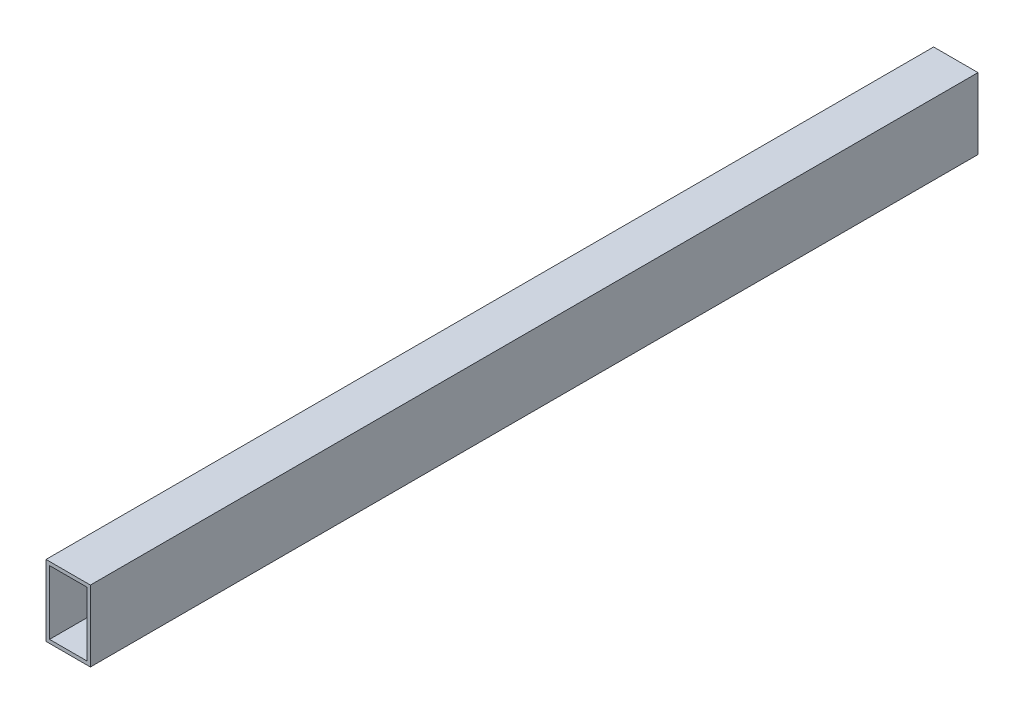
ISO-10303-21;
HEADER;
FILE_DESCRIPTION(('STEP AP214'),'2;1');
FILE_NAME('part.step','',(''),(''),'','','');
FILE_SCHEMA(('AUTOMOTIVE_DESIGN { 1 0 10303 214 1 1 1 1 }'));
ENDSEC;
DATA;
#1=APPLICATION_CONTEXT('core data for automotive mechanical design processes');
#2=APPLICATION_PROTOCOL_DEFINITION('international standard','automotive_design',2000,#1);
#3=PRODUCT_CONTEXT('',#1,'mechanical');
#4=PRODUCT('Part','Part','',(#3));
#5=PRODUCT_RELATED_PRODUCT_CATEGORY('part','',(#4));
#6=PRODUCT_DEFINITION_FORMATION('','',#4);
#7=PRODUCT_DEFINITION_CONTEXT('part definition',#1,'design');
#8=PRODUCT_DEFINITION('design','',#6,#7);
#9=PRODUCT_DEFINITION_SHAPE('','',#8);
#10=(LENGTH_UNIT() NAMED_UNIT(*) SI_UNIT(.MILLI.,.METRE.));
#11=(NAMED_UNIT(*) PLANE_ANGLE_UNIT() SI_UNIT($,.RADIAN.));
#12=(NAMED_UNIT(*) SI_UNIT($,.STERADIAN.) SOLID_ANGLE_UNIT());
#13=UNCERTAINTY_MEASURE_WITH_UNIT(LENGTH_MEASURE(1.E-05),#10,'distance_accuracy_value','');
#14=(GEOMETRIC_REPRESENTATION_CONTEXT(3) GLOBAL_UNCERTAINTY_ASSIGNED_CONTEXT((#13)) GLOBAL_UNIT_ASSIGNED_CONTEXT((#10,
#11,#12)) REPRESENTATION_CONTEXT('',''));
#15=CARTESIAN_POINT('',(0.,0.,0.));
#16=DIRECTION('',(0.,0.,1.));
#17=DIRECTION('',(1.,0.,0.));
#18=AXIS2_PLACEMENT_3D('',#15,#16,#17);
#19=CARTESIAN_POINT('',(-25.,40.,1000.));
#20=DIRECTION('',(1.,0.,0.));
#21=DIRECTION('',(0.,1.,0.));
#22=AXIS2_PLACEMENT_3D('',#19,#20,#21);
#23=PLANE('',#22);
#24=DIRECTION('',(0.,-1.,0.));
#25=VECTOR('',#24,1.);
#26=CARTESIAN_POINT('',(-25.,40.,0.));
#27=LINE('',#26,#25);
#28=CARTESIAN_POINT('',(-25.,40.,0.));
#29=VERTEX_POINT('',#28);
#30=CARTESIAN_POINT('',(-25.,-40.,0.));
#31=VERTEX_POINT('',#30);
#32=EDGE_CURVE('E147',#29,#31,#27,.T.);
#33=ORIENTED_EDGE('',*,*,#32,.T.);
#34=DIRECTION('',(0.,0.,-1.));
#35=VECTOR('',#34,1.);
#36=CARTESIAN_POINT('',(-25.,-40.,1000.));
#37=LINE('',#36,#35);
#38=CARTESIAN_POINT('',(-25.,-40.,1000.));
#39=VERTEX_POINT('',#38);
#40=EDGE_CURVE('E11',#39,#31,#37,.T.);
#41=ORIENTED_EDGE('',*,*,#40,.F.);
#42=DIRECTION('',(0.,-1.,0.));
#43=VECTOR('',#42,1.);
#44=CARTESIAN_POINT('',(-25.,40.,1000.));
#45=LINE('',#44,#43);
#46=CARTESIAN_POINT('',(-25.,40.,1000.));
#47=VERTEX_POINT('',#46);
#48=EDGE_CURVE('E153',#47,#39,#45,.T.);
#49=ORIENTED_EDGE('',*,*,#48,.F.);
#50=DIRECTION('',(0.,0.,-1.));
#51=VECTOR('',#50,1.);
#52=CARTESIAN_POINT('',(-25.,40.,1000.));
#53=LINE('',#52,#51);
#54=EDGE_CURVE('E169',#47,#29,#53,.T.);
#55=ORIENTED_EDGE('',*,*,#54,.T.);
#56=EDGE_LOOP('',(#33,#41,#49,#55));
#57=FACE_BOUND('',#56,.T.);
#58=ADVANCED_FACE('F39',(#57),#23,.F.);
#59=CARTESIAN_POINT('',(-25.,-40.,1000.));
#60=DIRECTION('',(0.,1.,0.));
#61=DIRECTION('',(0.,0.,1.));
#62=AXIS2_PLACEMENT_3D('',#59,#60,#61);
#63=PLANE('',#62);
#64=DIRECTION('',(1.,0.,0.));
#65=VECTOR('',#64,1.);
#66=CARTESIAN_POINT('',(-25.,-40.,0.));
#67=LINE('',#66,#65);
#68=CARTESIAN_POINT('',(25.,-40.,0.));
#69=VERTEX_POINT('',#68);
#70=EDGE_CURVE('E173',#31,#69,#67,.T.);
#71=ORIENTED_EDGE('',*,*,#70,.T.);
#72=DIRECTION('',(0.,0.,-1.));
#73=VECTOR('',#72,1.);
#74=CARTESIAN_POINT('',(25.,-40.,1000.));
#75=LINE('',#74,#73);
#76=CARTESIAN_POINT('',(25.,-40.,1000.));
#77=VERTEX_POINT('',#76);
#78=EDGE_CURVE('E47',#77,#69,#75,.T.);
#79=ORIENTED_EDGE('',*,*,#78,.F.);
#80=DIRECTION('',(1.,0.,0.));
#81=VECTOR('',#80,1.);
#82=CARTESIAN_POINT('',(-25.,-40.,1000.));
#83=LINE('',#82,#81);
#84=EDGE_CURVE('E157',#39,#77,#83,.T.);
#85=ORIENTED_EDGE('',*,*,#84,.F.);
#86=ORIENTED_EDGE('',*,*,#40,.T.);
#87=EDGE_LOOP('',(#71,#79,#85,#86));
#88=FACE_BOUND('',#87,.T.);
#89=ADVANCED_FACE('F195',(#88),#63,.F.);
#90=CARTESIAN_POINT('',(25.,40.,1000.));
#91=DIRECTION('',(1.,0.,0.));
#92=DIRECTION('',(0.,0.,-1.));
#93=AXIS2_PLACEMENT_3D('',#90,#91,#92);
#94=PLANE('',#93);
#95=DIRECTION('',(0.,-1.,0.));
#96=VECTOR('',#95,1.);
#97=CARTESIAN_POINT('',(25.,40.,0.));
#98=LINE('',#97,#96);
#99=CARTESIAN_POINT('',(25.,40.,0.));
#100=VERTEX_POINT('',#99);
#101=EDGE_CURVE('E177',#100,#69,#98,.T.);
#102=ORIENTED_EDGE('',*,*,#101,.F.);
#103=DIRECTION('',(0.,0.,-1.));
#104=VECTOR('',#103,1.);
#105=CARTESIAN_POINT('',(25.,40.,1000.));
#106=LINE('',#105,#104);
#107=CARTESIAN_POINT('',(25.,40.,1000.));
#108=VERTEX_POINT('',#107);
#109=EDGE_CURVE('E186',#108,#100,#106,.T.);
#110=ORIENTED_EDGE('',*,*,#109,.F.);
#111=DIRECTION('',(0.,-1.,0.));
#112=VECTOR('',#111,1.);
#113=CARTESIAN_POINT('',(25.,40.,1000.));
#114=LINE('',#113,#112);
#115=EDGE_CURVE('E161',#108,#77,#114,.T.);
#116=ORIENTED_EDGE('',*,*,#115,.T.);
#117=ORIENTED_EDGE('',*,*,#78,.T.);
#118=EDGE_LOOP('',(#102,#110,#116,#117));
#119=FACE_BOUND('',#118,.T.);
#120=ADVANCED_FACE('F192',(#119),#94,.T.);
#121=CARTESIAN_POINT('',(-25.,40.,1000.));
#122=DIRECTION('',(0.,1.,0.));
#123=DIRECTION('',(0.,0.,1.));
#124=AXIS2_PLACEMENT_3D('',#121,#122,#123);
#125=PLANE('',#124);
#126=DIRECTION('',(1.,0.,0.));
#127=VECTOR('',#126,1.);
#128=CARTESIAN_POINT('',(-25.,40.,0.));
#129=LINE('',#128,#127);
#130=EDGE_CURVE('E158',#29,#100,#129,.T.);
#131=ORIENTED_EDGE('',*,*,#130,.F.);
#132=ORIENTED_EDGE('',*,*,#54,.F.);
#133=DIRECTION('',(1.,0.,0.));
#134=VECTOR('',#133,1.);
#135=CARTESIAN_POINT('',(-25.,40.,1000.));
#136=LINE('',#135,#134);
#137=EDGE_CURVE('E165',#47,#108,#136,.T.);
#138=ORIENTED_EDGE('',*,*,#137,.T.);
#139=ORIENTED_EDGE('',*,*,#109,.T.);
#140=EDGE_LOOP('',(#131,#132,#138,#139));
#141=FACE_BOUND('',#140,.T.);
#142=ADVANCED_FACE('F202',(#141),#125,.T.);
#143=CARTESIAN_POINT('',(0.,0.,1000.));
#144=DIRECTION('',(0.,0.,1.));
#145=DIRECTION('',(1.,0.,0.));
#146=AXIS2_PLACEMENT_3D('',#143,#144,#145);
#147=PLANE('',#146);
#148=DIRECTION('',(0.,1.,0.));
#149=VECTOR('',#148,1.);
#150=CARTESIAN_POINT('',(-21.,36.,1000.));
#151=LINE('',#150,#149);
#152=CARTESIAN_POINT('',(-21.,-36.,1000.));
#153=VERTEX_POINT('',#152);
#154=CARTESIAN_POINT('',(-21.,36.,1000.));
#155=VERTEX_POINT('',#154);
#156=EDGE_CURVE('E106',#153,#155,#151,.T.);
#157=ORIENTED_EDGE('',*,*,#156,.T.);
#158=DIRECTION('',(1.,0.,0.));
#159=VECTOR('',#158,1.);
#160=CARTESIAN_POINT('',(21.,36.,1000.));
#161=LINE('',#160,#159);
#162=CARTESIAN_POINT('',(21.,36.,1000.));
#163=VERTEX_POINT('',#162);
#164=EDGE_CURVE('E116',#155,#163,#161,.T.);
#165=ORIENTED_EDGE('',*,*,#164,.T.);
#166=DIRECTION('',(0.,-1.,0.));
#167=VECTOR('',#166,1.);
#168=CARTESIAN_POINT('',(21.,36.,1000.));
#169=LINE('',#168,#167);
#170=CARTESIAN_POINT('',(21.,-36.,1000.));
#171=VERTEX_POINT('',#170);
#172=EDGE_CURVE('E54',#163,#171,#169,.T.);
#173=ORIENTED_EDGE('',*,*,#172,.T.);
#174=DIRECTION('',(-1.,0.,0.));
#175=VECTOR('',#174,1.);
#176=CARTESIAN_POINT('',(21.,-36.,1000.));
#177=LINE('',#176,#175);
#178=EDGE_CURVE('E113',#171,#153,#177,.T.);
#179=ORIENTED_EDGE('',*,*,#178,.T.);
#180=EDGE_LOOP('',(#157,#165,#173,#179));
#181=FACE_BOUND('',#180,.T.);
#182=ORIENTED_EDGE('',*,*,#48,.T.);
#183=ORIENTED_EDGE('',*,*,#84,.T.);
#184=ORIENTED_EDGE('',*,*,#115,.F.);
#185=ORIENTED_EDGE('',*,*,#137,.F.);
#186=EDGE_LOOP('',(#182,#183,#184,#185));
#187=FACE_BOUND('',#186,.T.);
#188=ADVANCED_FACE('F121',(#181,#187),#147,.T.);
#189=CARTESIAN_POINT('',(0.,0.,0.));
#190=DIRECTION('',(0.,0.,1.));
#191=DIRECTION('',(1.,0.,0.));
#192=AXIS2_PLACEMENT_3D('',#189,#190,#191);
#193=PLANE('',#192);
#194=DIRECTION('',(1.,0.,0.));
#195=VECTOR('',#194,1.);
#196=CARTESIAN_POINT('',(21.,36.,0.));
#197=LINE('',#196,#195);
#198=CARTESIAN_POINT('',(-21.,36.,0.));
#199=VERTEX_POINT('',#198);
#200=CARTESIAN_POINT('',(21.,36.,0.));
#201=VERTEX_POINT('',#200);
#202=EDGE_CURVE('E138',#199,#201,#197,.T.);
#203=ORIENTED_EDGE('',*,*,#202,.F.);
#204=DIRECTION('',(0.,1.,0.));
#205=VECTOR('',#204,1.);
#206=CARTESIAN_POINT('',(-21.,36.,0.));
#207=LINE('',#206,#205);
#208=CARTESIAN_POINT('',(-21.,-36.,0.));
#209=VERTEX_POINT('',#208);
#210=EDGE_CURVE('E62',#209,#199,#207,.T.);
#211=ORIENTED_EDGE('',*,*,#210,.F.);
#212=DIRECTION('',(-1.,0.,0.));
#213=VECTOR('',#212,1.);
#214=CARTESIAN_POINT('',(21.,-36.,0.));
#215=LINE('',#214,#213);
#216=CARTESIAN_POINT('',(21.,-36.,0.));
#217=VERTEX_POINT('',#216);
#218=EDGE_CURVE('E125',#217,#209,#215,.T.);
#219=ORIENTED_EDGE('',*,*,#218,.F.);
#220=DIRECTION('',(0.,-1.,0.));
#221=VECTOR('',#220,1.);
#222=CARTESIAN_POINT('',(21.,36.,0.));
#223=LINE('',#222,#221);
#224=EDGE_CURVE('E129',#201,#217,#223,.T.);
#225=ORIENTED_EDGE('',*,*,#224,.F.);
#226=EDGE_LOOP('',(#203,#211,#219,#225));
#227=FACE_BOUND('',#226,.T.);
#228=ORIENTED_EDGE('',*,*,#32,.F.);
#229=ORIENTED_EDGE('',*,*,#130,.T.);
#230=ORIENTED_EDGE('',*,*,#101,.T.);
#231=ORIENTED_EDGE('',*,*,#70,.F.);
#232=EDGE_LOOP('',(#228,#229,#230,#231));
#233=FACE_BOUND('',#232,.T.);
#234=ADVANCED_FACE('F199',(#227,#233),#193,.F.);
#235=CARTESIAN_POINT('',(-21.,36.,1000.));
#236=DIRECTION('',(-1.,0.,0.));
#237=DIRECTION('',(0.,-1.,0.));
#238=AXIS2_PLACEMENT_3D('',#235,#236,#237);
#239=PLANE('',#238);
#240=ORIENTED_EDGE('',*,*,#210,.T.);
#241=DIRECTION('',(0.,0.,-1.));
#242=VECTOR('',#241,1.);
#243=CARTESIAN_POINT('',(-21.,36.,1000.));
#244=LINE('',#243,#242);
#245=EDGE_CURVE('E102',#155,#199,#244,.T.);
#246=ORIENTED_EDGE('',*,*,#245,.F.);
#247=ORIENTED_EDGE('',*,*,#156,.F.);
#248=DIRECTION('',(0.,0.,-1.));
#249=VECTOR('',#248,1.);
#250=CARTESIAN_POINT('',(-21.,-36.,1000.));
#251=LINE('',#250,#249);
#252=EDGE_CURVE('E144',#153,#209,#251,.T.);
#253=ORIENTED_EDGE('',*,*,#252,.T.);
#254=EDGE_LOOP('',(#240,#246,#247,#253));
#255=FACE_BOUND('',#254,.T.);
#256=ADVANCED_FACE('F104',(#255),#239,.F.);
#257=CARTESIAN_POINT('',(21.,-36.,1000.));
#258=DIRECTION('',(0.,-1.,0.));
#259=DIRECTION('',(0.,0.,-1.));
#260=AXIS2_PLACEMENT_3D('',#257,#258,#259);
#261=PLANE('',#260);
#262=ORIENTED_EDGE('',*,*,#218,.T.);
#263=ORIENTED_EDGE('',*,*,#252,.F.);
#264=ORIENTED_EDGE('',*,*,#178,.F.);
#265=DIRECTION('',(0.,0.,-1.));
#266=VECTOR('',#265,1.);
#267=CARTESIAN_POINT('',(21.,-36.,1000.));
#268=LINE('',#267,#266);
#269=EDGE_CURVE('E148',#171,#217,#268,.T.);
#270=ORIENTED_EDGE('',*,*,#269,.T.);
#271=EDGE_LOOP('',(#262,#263,#264,#270));
#272=FACE_BOUND('',#271,.T.);
#273=ADVANCED_FACE('F224',(#272),#261,.F.);
#274=CARTESIAN_POINT('',(21.,36.,1000.));
#275=DIRECTION('',(1.,0.,0.));
#276=DIRECTION('',(0.,1.,0.));
#277=AXIS2_PLACEMENT_3D('',#274,#275,#276);
#278=PLANE('',#277);
#279=ORIENTED_EDGE('',*,*,#224,.T.);
#280=ORIENTED_EDGE('',*,*,#269,.F.);
#281=ORIENTED_EDGE('',*,*,#172,.F.);
#282=DIRECTION('',(0.,0.,-1.));
#283=VECTOR('',#282,1.);
#284=CARTESIAN_POINT('',(21.,36.,1000.));
#285=LINE('',#284,#283);
#286=EDGE_CURVE('E112',#163,#201,#285,.T.);
#287=ORIENTED_EDGE('',*,*,#286,.T.);
#288=EDGE_LOOP('',(#279,#280,#281,#287));
#289=FACE_BOUND('',#288,.T.);
#290=ADVANCED_FACE('F227',(#289),#278,.F.);
#291=CARTESIAN_POINT('',(21.,36.,1000.));
#292=DIRECTION('',(0.,1.,0.));
#293=DIRECTION('',(0.,0.,1.));
#294=AXIS2_PLACEMENT_3D('',#291,#292,#293);
#295=PLANE('',#294);
#296=ORIENTED_EDGE('',*,*,#202,.T.);
#297=ORIENTED_EDGE('',*,*,#286,.F.);
#298=ORIENTED_EDGE('',*,*,#164,.F.);
#299=ORIENTED_EDGE('',*,*,#245,.T.);
#300=EDGE_LOOP('',(#296,#297,#298,#299));
#301=FACE_BOUND('',#300,.T.);
#302=ADVANCED_FACE('F117',(#301),#295,.F.);
#303=CLOSED_SHELL('',(#58,#89,#120,#142,#188,#234,#256,#273,#290,#302));
#304=MANIFOLD_SOLID_BREP('B2',#303);
#305=ADVANCED_BREP_SHAPE_REPRESENTATION('',(#18,#304),#14);
#306=SHAPE_DEFINITION_REPRESENTATION(#9,#305);
ENDSEC;
END-ISO-10303-21;
